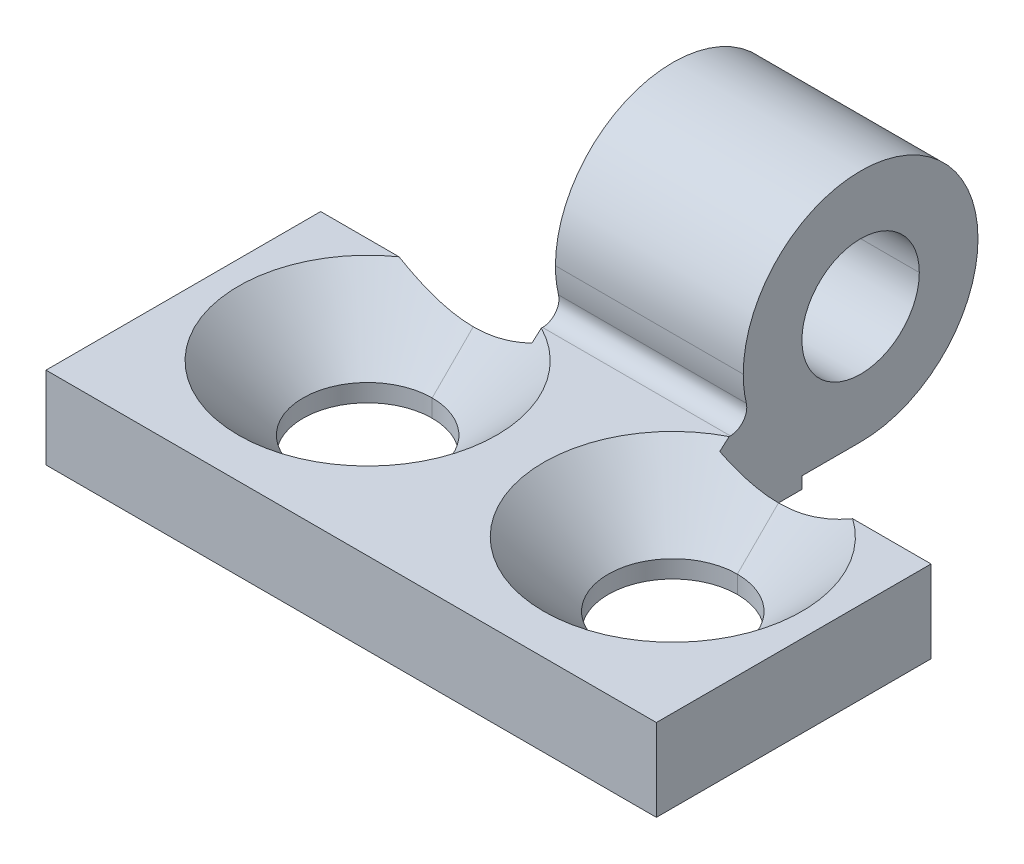
ISO-10303-21;
HEADER;
FILE_DESCRIPTION(('STEP AP214'),'2;1');
FILE_NAME('part.step','',(''),(''),'','','');
FILE_SCHEMA(('AUTOMOTIVE_DESIGN { 1 0 10303 214 1 1 1 1 }'));
ENDSEC;
DATA;
#1=APPLICATION_CONTEXT('core data for automotive mechanical design processes');
#2=APPLICATION_PROTOCOL_DEFINITION('international standard','automotive_design',2000,#1);
#3=PRODUCT_CONTEXT('',#1,'mechanical');
#4=PRODUCT('Part','Part','',(#3));
#5=PRODUCT_RELATED_PRODUCT_CATEGORY('part','',(#4));
#6=PRODUCT_DEFINITION_FORMATION('','',#4);
#7=PRODUCT_DEFINITION_CONTEXT('part definition',#1,'design');
#8=PRODUCT_DEFINITION('design','',#6,#7);
#9=PRODUCT_DEFINITION_SHAPE('','',#8);
#10=(LENGTH_UNIT() NAMED_UNIT(*) SI_UNIT(.MILLI.,.METRE.));
#11=(NAMED_UNIT(*) PLANE_ANGLE_UNIT() SI_UNIT($,.RADIAN.));
#12=(NAMED_UNIT(*) SI_UNIT($,.STERADIAN.) SOLID_ANGLE_UNIT());
#13=UNCERTAINTY_MEASURE_WITH_UNIT(LENGTH_MEASURE(1.E-05),#10,'distance_accuracy_value','');
#14=(GEOMETRIC_REPRESENTATION_CONTEXT(3) GLOBAL_UNCERTAINTY_ASSIGNED_CONTEXT((#13)) GLOBAL_UNIT_ASSIGNED_CONTEXT((#10,
#11,#12)) REPRESENTATION_CONTEXT('',''));
#15=CARTESIAN_POINT('',(0.,0.,0.));
#16=DIRECTION('',(0.,0.,1.));
#17=DIRECTION('',(1.,0.,0.));
#18=AXIS2_PLACEMENT_3D('',#15,#16,#17);
#19=CARTESIAN_POINT('',(-6.5,-2.,10.5));
#20=DIRECTION('',(0.,1.,0.));
#21=DIRECTION('',(0.,0.,1.));
#22=AXIS2_PLACEMENT_3D('',#19,#20,#21);
#23=CYLINDRICAL_SURFACE('',#22,2.75);
#24=DIRECTION('',(0.,1.,0.));
#25=VECTOR('',#24,1.);
#26=CARTESIAN_POINT('',(-6.5,-2.,7.75));
#27=LINE('',#26,#25);
#28=CARTESIAN_POINT('',(-6.5,-5.5,7.75));
#29=VERTEX_POINT('',#28);
#30=CARTESIAN_POINT('',(-6.5,-4.75,7.75));
#31=VERTEX_POINT('',#30);
#32=EDGE_CURVE('E259',#29,#31,#27,.T.);
#33=ORIENTED_EDGE('',*,*,#32,.F.);
#34=CARTESIAN_POINT('',(-6.5,-5.5,10.5));
#35=DIRECTION('',(0.,1.,0.));
#36=DIRECTION('',(0.,0.,1.));
#37=AXIS2_PLACEMENT_3D('',#34,#35,#36);
#38=CIRCLE('',#37,2.75);
#39=CARTESIAN_POINT('',(-6.5,-5.5,13.25));
#40=VERTEX_POINT('',#39);
#41=EDGE_CURVE('E206',#40,#29,#38,.T.);
#42=ORIENTED_EDGE('',*,*,#41,.F.);
#43=DIRECTION('',(0.,1.,0.));
#44=VECTOR('',#43,1.);
#45=CARTESIAN_POINT('',(-6.5,-2.,13.25));
#46=LINE('',#45,#44);
#47=CARTESIAN_POINT('',(-6.5,-4.75,13.25));
#48=VERTEX_POINT('',#47);
#49=EDGE_CURVE('E288',#40,#48,#46,.T.);
#50=ORIENTED_EDGE('',*,*,#49,.T.);
#51=CARTESIAN_POINT('',(-6.5,-4.75,10.5));
#52=DIRECTION('',(0.,1.,0.));
#53=DIRECTION('',(0.,0.,1.));
#54=AXIS2_PLACEMENT_3D('',#51,#52,#53);
#55=CIRCLE('',#54,2.75);
#56=EDGE_CURVE('E11',#48,#31,#55,.T.);
#57=ORIENTED_EDGE('',*,*,#56,.T.);
#58=EDGE_LOOP('',(#33,#42,#50,#57));
#59=FACE_BOUND('',#58,.T.);
#60=ADVANCED_FACE('F17',(#59),#23,.F.);
#61=CARTESIAN_POINT('',(-6.5,-2.,10.5));
#62=DIRECTION('',(0.,1.,0.));
#63=DIRECTION('',(0.,0.,1.));
#64=AXIS2_PLACEMENT_3D('',#61,#62,#63);
#65=CONICAL_SURFACE('',#64,5.5,0.785398163397448);
#66=DIRECTION('',(0.,0.707106781186548,-0.707106781186547));
#67=VECTOR('',#66,1.);
#68=CARTESIAN_POINT('',(-6.5,-2.,5.));
#69=LINE('',#68,#67);
#70=CARTESIAN_POINT('',(-6.5,-3.00000000000008,6.));
#71=VERTEX_POINT('',#70);
#72=EDGE_CURVE('E375',#31,#71,#69,.T.);
#73=ORIENTED_EDGE('',*,*,#72,.F.);
#74=ORIENTED_EDGE('',*,*,#56,.F.);
#75=DIRECTION('',(0.,0.707106781186548,0.707106781186548));
#76=VECTOR('',#75,1.);
#77=CARTESIAN_POINT('',(-6.5,-2.,16.));
#78=LINE('',#77,#76);
#79=CARTESIAN_POINT('',(-6.5,-2.,16.));
#80=VERTEX_POINT('',#79);
#81=EDGE_CURVE('E465',#48,#80,#78,.T.);
#82=ORIENTED_EDGE('',*,*,#81,.T.);
#83=CARTESIAN_POINT('',(-6.5,-2.,10.5));
#84=DIRECTION('',(0.,1.,0.));
#85=DIRECTION('',(0.,0.,1.));
#86=AXIS2_PLACEMENT_3D('',#83,#84,#85);
#87=CIRCLE('',#86,5.5);
#88=CARTESIAN_POINT('',(-4.,-2.,5.60102051443365));
#89=VERTEX_POINT('',#88);
#90=EDGE_CURVE('E237',#80,#89,#87,.T.);
#91=ORIENTED_EDGE('',*,*,#90,.T.);
#92=CARTESIAN_POINT('',(-4.,-2.3521849295065,6.));
#93=CARTESIAN_POINT('',(-4.,-2.23544632125815,5.86645582958906));
#94=CARTESIAN_POINT('',(-4.,-2.11799221506182,5.73348834467298));
#95=CARTESIAN_POINT('',(-4.,-2.,5.60102051443365));
#96=(BOUNDED_CURVE() B_SPLINE_CURVE(3,(#92,#93,#94,#95),.UNSPECIFIED.,.F.,
.F.) B_SPLINE_CURVE_WITH_KNOTS((4,4),(0.00209591535609788,0.00262788306866856),
.UNSPECIFIED.) CURVE() GEOMETRIC_REPRESENTATION_ITEM() RATIONAL_B_SPLINE_CURVE((1.,1.,1.,1.)) REPRESENTATION_ITEM(''));
#97=CARTESIAN_POINT('',(-4.,-2.3521849295065,6.));
#98=VERTEX_POINT('',#97);
#99=EDGE_CURVE('E43',#98,#89,#96,.T.);
#100=ORIENTED_EDGE('',*,*,#99,.F.);
#101=CARTESIAN_POINT('',(-6.5,-3.,6.));
#102=CARTESIAN_POINT('',(-5.87172955955055,-3.,6.));
#103=CARTESIAN_POINT('',(-5.21795002886599,-2.82093469499679,6.));
#104=CARTESIAN_POINT('',(-4.63830987725806,-2.66217560929837,6.));
#105=CARTESIAN_POINT('',(-4.,-2.3521849295065,6.));
#106=B_SPLINE_CURVE_WITH_KNOTS('',2,(#101,#102,#103,#104,#105),.UNSPECIFIED.,.F.,.F.,(3,2,3),
(0.,0.5,1.),.UNSPECIFIED.);
#107=EDGE_CURVE('E190',#71,#98,#106,.T.);
#108=ORIENTED_EDGE('',*,*,#107,.F.);
#109=EDGE_LOOP('',(#73,#74,#82,#91,#100,#108));
#110=FACE_BOUND('',#109,.T.);
#111=ADVANCED_FACE('F363',(#110),#65,.F.);
#112=CARTESIAN_POINT('',(6.5,-2.,10.5));
#113=DIRECTION('',(0.,1.,0.));
#114=DIRECTION('',(0.,0.,1.));
#115=AXIS2_PLACEMENT_3D('',#112,#113,#114);
#116=CYLINDRICAL_SURFACE('',#115,2.75);
#117=DIRECTION('',(0.,1.,0.));
#118=VECTOR('',#117,1.);
#119=CARTESIAN_POINT('',(6.5,-2.,7.75));
#120=LINE('',#119,#118);
#121=CARTESIAN_POINT('',(6.5,-5.5,7.75));
#122=VERTEX_POINT('',#121);
#123=CARTESIAN_POINT('',(6.5,-4.75,7.75));
#124=VERTEX_POINT('',#123);
#125=EDGE_CURVE('E248',#122,#124,#120,.T.);
#126=ORIENTED_EDGE('',*,*,#125,.F.);
#127=CARTESIAN_POINT('',(6.5,-5.5,10.5));
#128=DIRECTION('',(0.,1.,0.));
#129=DIRECTION('',(0.,0.,1.));
#130=AXIS2_PLACEMENT_3D('',#127,#128,#129);
#131=CIRCLE('',#130,2.75);
#132=CARTESIAN_POINT('',(6.5,-5.5,13.25));
#133=VERTEX_POINT('',#132);
#134=EDGE_CURVE('E232',#133,#122,#131,.T.);
#135=ORIENTED_EDGE('',*,*,#134,.F.);
#136=DIRECTION('',(0.,1.,0.));
#137=VECTOR('',#136,1.);
#138=CARTESIAN_POINT('',(6.5,-2.,13.25));
#139=LINE('',#138,#137);
#140=CARTESIAN_POINT('',(6.5,-4.75,13.25));
#141=VERTEX_POINT('',#140);
#142=EDGE_CURVE('E247',#133,#141,#139,.T.);
#143=ORIENTED_EDGE('',*,*,#142,.T.);
#144=CARTESIAN_POINT('',(6.5,-4.75,10.5));
#145=DIRECTION('',(0.,1.,0.));
#146=DIRECTION('',(0.,0.,1.));
#147=AXIS2_PLACEMENT_3D('',#144,#145,#146);
#148=CIRCLE('',#147,2.75);
#149=EDGE_CURVE('E28',#141,#124,#148,.T.);
#150=ORIENTED_EDGE('',*,*,#149,.T.);
#151=EDGE_LOOP('',(#126,#135,#143,#150));
#152=FACE_BOUND('',#151,.T.);
#153=ADVANCED_FACE('F367',(#152),#116,.F.);
#154=CARTESIAN_POINT('',(6.5,-2.,10.5));
#155=DIRECTION('',(0.,1.,0.));
#156=DIRECTION('',(0.,0.,1.));
#157=AXIS2_PLACEMENT_3D('',#154,#155,#156);
#158=CONICAL_SURFACE('',#157,5.5,0.785398163397448);
#159=DIRECTION('',(0.,0.707106781186548,-0.707106781186547));
#160=VECTOR('',#159,1.);
#161=CARTESIAN_POINT('',(6.5,-2.,5.));
#162=LINE('',#161,#160);
#163=CARTESIAN_POINT('',(6.5,-3.,6.));
#164=VERTEX_POINT('',#163);
#165=EDGE_CURVE('E455',#124,#164,#162,.T.);
#166=ORIENTED_EDGE('',*,*,#165,.F.);
#167=ORIENTED_EDGE('',*,*,#149,.F.);
#168=DIRECTION('',(0.,0.707106781186548,0.707106781186548));
#169=VECTOR('',#168,1.);
#170=CARTESIAN_POINT('',(6.5,-2.,16.));
#171=LINE('',#170,#169);
#172=CARTESIAN_POINT('',(6.5,-2.,16.));
#173=VERTEX_POINT('',#172);
#174=EDGE_CURVE('E496',#141,#173,#171,.T.);
#175=ORIENTED_EDGE('',*,*,#174,.T.);
#176=CARTESIAN_POINT('',(6.5,-2.,10.5));
#177=DIRECTION('',(0.,1.,0.));
#178=DIRECTION('',(0.,0.,1.));
#179=AXIS2_PLACEMENT_3D('',#176,#177,#178);
#180=CIRCLE('',#179,5.5);
#181=CARTESIAN_POINT('',(9.66227766016838,-2.,6.));
#182=VERTEX_POINT('',#181);
#183=EDGE_CURVE('E582',#173,#182,#180,.T.);
#184=ORIENTED_EDGE('',*,*,#183,.T.);
#185=CARTESIAN_POINT('',(6.5,-3.,6.));
#186=CARTESIAN_POINT('',(7.29819902834633,-3.,6.));
#187=CARTESIAN_POINT('',(8.14875076669023,-2.70746631825487,6.));
#188=CARTESIAN_POINT('',(8.85322029363691,-2.46517527926856,6.));
#189=CARTESIAN_POINT('',(9.66227766016838,-2.,6.));
#190=B_SPLINE_CURVE_WITH_KNOTS('',2,(#185,#186,#187,#188,#189),.UNSPECIFIED.,.F.,.F.,(3,2,3),
(0.,0.5,1.),.UNSPECIFIED.);
#191=EDGE_CURVE('E293',#164,#182,#190,.T.);
#192=ORIENTED_EDGE('',*,*,#191,.F.);
#193=EDGE_LOOP('',(#166,#167,#175,#184,#192));
#194=FACE_BOUND('',#193,.T.);
#195=ADVANCED_FACE('F641',(#194),#158,.F.);
#196=CARTESIAN_POINT('',(4.,5.,6.));
#197=DIRECTION('',(-1.,0.,0.));
#198=DIRECTION('',(0.,0.,1.));
#199=AXIS2_PLACEMENT_3D('',#196,#197,#198);
#200=PLANE('',#199);
#201=CARTESIAN_POINT('',(4.,0.,0.));
#202=DIRECTION('',(-1.,0.,0.));
#203=DIRECTION('',(0.,0.,1.));
#204=AXIS2_PLACEMENT_3D('',#201,#202,#203);
#205=CIRCLE('',#204,2.5);
#206=CARTESIAN_POINT('',(4.,0.,2.5));
#207=VERTEX_POINT('',#206);
#208=CARTESIAN_POINT('',(4.,0.,-2.5));
#209=VERTEX_POINT('',#208);
#210=EDGE_CURVE('E279',#207,#209,#205,.T.);
#211=ORIENTED_EDGE('',*,*,#210,.T.);
#212=CARTESIAN_POINT('',(4.,0.,0.));
#213=DIRECTION('',(-1.,0.,0.));
#214=DIRECTION('',(0.,0.,1.));
#215=AXIS2_PLACEMENT_3D('',#212,#213,#214);
#216=CIRCLE('',#215,2.5);
#217=EDGE_CURVE('E434',#209,#207,#216,.T.);
#218=ORIENTED_EDGE('',*,*,#217,.T.);
#219=EDGE_LOOP('',(#211,#218));
#220=FACE_BOUND('',#219,.T.);
#221=DIRECTION('',(0.,0.,-1.));
#222=VECTOR('',#221,1.);
#223=CARTESIAN_POINT('',(4.,-2.,4.58257569495584));
#224=LINE('',#223,#222);
#225=CARTESIAN_POINT('',(4.,-2.,5.60102051443364));
#226=VERTEX_POINT('',#225);
#227=CARTESIAN_POINT('',(4.,-2.,5.54977477020464));
#228=VERTEX_POINT('',#227);
#229=EDGE_CURVE('E224',#226,#228,#224,.T.);
#230=ORIENTED_EDGE('',*,*,#229,.F.);
#231=CARTESIAN_POINT('',(4.,-2.,5.60102051443364));
#232=CARTESIAN_POINT('',(4.,-2.11799221506182,5.73348834467298));
#233=CARTESIAN_POINT('',(4.,-2.23544632125815,5.86645582958905));
#234=CARTESIAN_POINT('',(4.,-2.3521849295065,6.));
#235=(BOUNDED_CURVE() B_SPLINE_CURVE(3,(#231,#232,#233,#234),.UNSPECIFIED.,.F.,
.F.) B_SPLINE_CURVE_WITH_KNOTS((4,4),(0.00563640099351163,0.00616843623537181),
.UNSPECIFIED.) CURVE() GEOMETRIC_REPRESENTATION_ITEM() RATIONAL_B_SPLINE_CURVE((1.,1.,1.,1.)) REPRESENTATION_ITEM(''));
#236=CARTESIAN_POINT('',(4.,-2.3521849295065,6.));
#237=VERTEX_POINT('',#236);
#238=EDGE_CURVE('E531',#226,#237,#235,.T.);
#239=ORIENTED_EDGE('',*,*,#238,.T.);
#240=DIRECTION('',(0.,-1.,0.));
#241=VECTOR('',#240,1.);
#242=CARTESIAN_POINT('',(4.,5.,6.));
#243=LINE('',#242,#241);
#244=CARTESIAN_POINT('',(4.,-5.5,6.));
#245=VERTEX_POINT('',#244);
#246=EDGE_CURVE('E335',#237,#245,#243,.T.);
#247=ORIENTED_EDGE('',*,*,#246,.T.);
#248=DIRECTION('',(0.,0.,-1.));
#249=VECTOR('',#248,1.);
#250=CARTESIAN_POINT('',(4.,-5.5,6.));
#251=LINE('',#250,#249);
#252=CARTESIAN_POINT('',(4.,-5.5,2.5));
#253=VERTEX_POINT('',#252);
#254=EDGE_CURVE('E220',#245,#253,#251,.T.);
#255=ORIENTED_EDGE('',*,*,#254,.T.);
#256=DIRECTION('',(0.,-1.,0.));
#257=VECTOR('',#256,1.);
#258=CARTESIAN_POINT('',(4.,-5.5,2.5));
#259=LINE('',#258,#257);
#260=CARTESIAN_POINT('',(4.,-5.,2.5));
#261=VERTEX_POINT('',#260);
#262=EDGE_CURVE('E226',#261,#253,#259,.T.);
#263=ORIENTED_EDGE('',*,*,#262,.F.);
#264=DIRECTION('',(0.,0.,1.));
#265=VECTOR('',#264,1.);
#266=CARTESIAN_POINT('',(4.,-5.,2.5));
#267=LINE('',#266,#265);
#268=CARTESIAN_POINT('',(4.,-5.,0.));
#269=VERTEX_POINT('',#268);
#270=EDGE_CURVE('E254',#269,#261,#267,.T.);
#271=ORIENTED_EDGE('',*,*,#270,.F.);
#272=CARTESIAN_POINT('',(4.,0.,0.));
#273=DIRECTION('',(-1.,0.,0.));
#274=DIRECTION('',(0.,0.,1.));
#275=AXIS2_PLACEMENT_3D('',#272,#273,#274);
#276=CIRCLE('',#275,5.);
#277=CARTESIAN_POINT('',(4.,0.,-5.));
#278=VERTEX_POINT('',#277);
#279=EDGE_CURVE('E435',#278,#269,#276,.T.);
#280=ORIENTED_EDGE('',*,*,#279,.F.);
#281=CARTESIAN_POINT('',(4.,0.,0.));
#282=DIRECTION('',(-1.,0.,0.));
#283=DIRECTION('',(0.,0.,1.));
#284=AXIS2_PLACEMENT_3D('',#281,#282,#283);
#285=CIRCLE('',#284,5.);
#286=CARTESIAN_POINT('',(4.,0.,5.));
#287=VERTEX_POINT('',#286);
#288=EDGE_CURVE('E283',#287,#278,#285,.T.);
#289=ORIENTED_EDGE('',*,*,#288,.F.);
#290=CARTESIAN_POINT('',(4.,0.,0.));
#291=DIRECTION('',(-1.,0.,0.));
#292=DIRECTION('',(0.,0.,1.));
#293=AXIS2_PLACEMENT_3D('',#290,#291,#292);
#294=CIRCLE('',#293,5.);
#295=CARTESIAN_POINT('',(4.,-1.14035087719298,4.86822348263565));
#296=VERTEX_POINT('',#295);
#297=EDGE_CURVE('E450',#296,#287,#294,.T.);
#298=ORIENTED_EDGE('',*,*,#297,.F.);
#299=CARTESIAN_POINT('',(4.,-1.3,5.54977477020464));
#300=DIRECTION('',(1.,0.,0.));
#301=DIRECTION('',(0.,0.,1.));
#302=AXIS2_PLACEMENT_3D('',#299,#300,#301);
#303=CIRCLE('',#302,0.7);
#304=EDGE_CURVE('E239',#228,#296,#303,.T.);
#305=ORIENTED_EDGE('',*,*,#304,.F.);
#306=EDGE_LOOP('',(#230,#239,#247,#255,#263,#271,#280,#289,#298,#305));
#307=FACE_BOUND('',#306,.T.);
#308=ADVANCED_FACE('F310',(#220,#307),#200,.F.);
#309=CARTESIAN_POINT('',(13.,5.,6.));
#310=DIRECTION('',(0.,0.,1.));
#311=DIRECTION('',(1.,0.,0.));
#312=AXIS2_PLACEMENT_3D('',#309,#310,#311);
#313=PLANE('',#312);
#314=ORIENTED_EDGE('',*,*,#246,.F.);
#315=CARTESIAN_POINT('',(4.,-2.3521849295065,6.));
#316=CARTESIAN_POINT('',(4.63356689461019,-2.65987221330369,6.));
#317=CARTESIAN_POINT('',(5.21025336837822,-2.81881998062672,6.));
#318=CARTESIAN_POINT('',(5.8676018058511,-3.,6.));
#319=CARTESIAN_POINT('',(6.5,-3.,6.));
#320=B_SPLINE_CURVE_WITH_KNOTS('',2,(#315,#316,#317,#318,#319),.UNSPECIFIED.,.F.,.F.,(3,2,3),
(0.,0.5,1.),.UNSPECIFIED.);
#321=EDGE_CURVE('E331',#237,#164,#320,.T.);
#322=ORIENTED_EDGE('',*,*,#321,.T.);
#323=ORIENTED_EDGE('',*,*,#191,.T.);
#324=DIRECTION('',(-1.,0.,0.));
#325=VECTOR('',#324,1.);
#326=CARTESIAN_POINT('',(13.,-2.,6.));
#327=LINE('',#326,#325);
#328=CARTESIAN_POINT('',(13.,-2.,6.));
#329=VERTEX_POINT('',#328);
#330=EDGE_CURVE('E586',#329,#182,#327,.T.);
#331=ORIENTED_EDGE('',*,*,#330,.F.);
#332=DIRECTION('',(0.,-1.,0.));
#333=VECTOR('',#332,1.);
#334=CARTESIAN_POINT('',(13.,5.,6.));
#335=LINE('',#334,#333);
#336=CARTESIAN_POINT('',(13.,-5.5,6.));
#337=VERTEX_POINT('',#336);
#338=EDGE_CURVE('E485',#329,#337,#335,.T.);
#339=ORIENTED_EDGE('',*,*,#338,.T.);
#340=DIRECTION('',(-1.,0.,0.));
#341=VECTOR('',#340,1.);
#342=CARTESIAN_POINT('',(13.,-5.5,6.));
#343=LINE('',#342,#341);
#344=EDGE_CURVE('E213',#337,#245,#343,.T.);
#345=ORIENTED_EDGE('',*,*,#344,.T.);
#346=EDGE_LOOP('',(#314,#322,#323,#331,#339,#345));
#347=FACE_BOUND('',#346,.T.);
#348=ADVANCED_FACE('F300',(#347),#313,.F.);
#349=CARTESIAN_POINT('',(-4.,5.,6.));
#350=DIRECTION('',(1.,0.,0.));
#351=DIRECTION('',(0.,1.,0.));
#352=AXIS2_PLACEMENT_3D('',#349,#350,#351);
#353=PLANE('',#352);
#354=CARTESIAN_POINT('',(-4.,0.,0.));
#355=DIRECTION('',(1.,0.,0.));
#356=DIRECTION('',(0.,0.,-1.));
#357=AXIS2_PLACEMENT_3D('',#354,#355,#356);
#358=CIRCLE('',#357,2.5);
#359=CARTESIAN_POINT('',(-4.,0.,2.5));
#360=VERTEX_POINT('',#359);
#361=CARTESIAN_POINT('',(-4.,0.,-2.5));
#362=VERTEX_POINT('',#361);
#363=EDGE_CURVE('E260',#360,#362,#358,.T.);
#364=ORIENTED_EDGE('',*,*,#363,.T.);
#365=CARTESIAN_POINT('',(-4.,0.,0.));
#366=DIRECTION('',(1.,0.,0.));
#367=DIRECTION('',(0.,0.,-1.));
#368=AXIS2_PLACEMENT_3D('',#365,#366,#367);
#369=CIRCLE('',#368,2.5);
#370=EDGE_CURVE('E243',#362,#360,#369,.T.);
#371=ORIENTED_EDGE('',*,*,#370,.T.);
#372=EDGE_LOOP('',(#364,#371));
#373=FACE_BOUND('',#372,.T.);
#374=DIRECTION('',(0.,-1.,0.));
#375=VECTOR('',#374,1.);
#376=CARTESIAN_POINT('',(-4.,5.,6.));
#377=LINE('',#376,#375);
#378=CARTESIAN_POINT('',(-4.,-5.5,6.));
#379=VERTEX_POINT('',#378);
#380=EDGE_CURVE('E182',#98,#379,#377,.T.);
#381=ORIENTED_EDGE('',*,*,#380,.F.);
#382=ORIENTED_EDGE('',*,*,#99,.T.);
#383=DIRECTION('',(0.,0.,1.));
#384=VECTOR('',#383,1.);
#385=CARTESIAN_POINT('',(-4.,-2.,4.58257569495584));
#386=LINE('',#385,#384);
#387=CARTESIAN_POINT('',(-4.,-2.,5.54977477020464));
#388=VERTEX_POINT('',#387);
#389=EDGE_CURVE('E233',#388,#89,#386,.T.);
#390=ORIENTED_EDGE('',*,*,#389,.F.);
#391=CARTESIAN_POINT('',(-4.,-1.3,5.54977477020464));
#392=DIRECTION('',(-1.,0.,0.));
#393=DIRECTION('',(0.,0.,-1.));
#394=AXIS2_PLACEMENT_3D('',#391,#392,#393);
#395=CIRCLE('',#394,0.7);
#396=CARTESIAN_POINT('',(-4.,-1.14035087719298,4.86822348263565));
#397=VERTEX_POINT('',#396);
#398=EDGE_CURVE('E242',#397,#388,#395,.T.);
#399=ORIENTED_EDGE('',*,*,#398,.F.);
#400=CARTESIAN_POINT('',(-4.,0.,0.));
#401=DIRECTION('',(1.,0.,0.));
#402=DIRECTION('',(0.,0.,-1.));
#403=AXIS2_PLACEMENT_3D('',#400,#401,#402);
#404=CIRCLE('',#403,5.);
#405=CARTESIAN_POINT('',(-4.,0.,5.));
#406=VERTEX_POINT('',#405);
#407=EDGE_CURVE('E510',#406,#397,#404,.T.);
#408=ORIENTED_EDGE('',*,*,#407,.F.);
#409=CARTESIAN_POINT('',(-4.,0.,0.));
#410=DIRECTION('',(1.,0.,0.));
#411=DIRECTION('',(0.,0.,-1.));
#412=AXIS2_PLACEMENT_3D('',#409,#410,#411);
#413=CIRCLE('',#412,5.);
#414=CARTESIAN_POINT('',(-4.,0.,-5.));
#415=VERTEX_POINT('',#414);
#416=EDGE_CURVE('E426',#415,#406,#413,.T.);
#417=ORIENTED_EDGE('',*,*,#416,.F.);
#418=CARTESIAN_POINT('',(-4.,0.,0.));
#419=DIRECTION('',(1.,0.,0.));
#420=DIRECTION('',(0.,0.,-1.));
#421=AXIS2_PLACEMENT_3D('',#418,#419,#420);
#422=CIRCLE('',#421,5.);
#423=CARTESIAN_POINT('',(-4.,-5.,0.));
#424=VERTEX_POINT('',#423);
#425=EDGE_CURVE('E238',#424,#415,#422,.T.);
#426=ORIENTED_EDGE('',*,*,#425,.F.);
#427=DIRECTION('',(0.,0.,-1.));
#428=VECTOR('',#427,1.);
#429=CARTESIAN_POINT('',(-4.,-5.,2.5));
#430=LINE('',#429,#428);
#431=CARTESIAN_POINT('',(-4.,-5.,2.5));
#432=VERTEX_POINT('',#431);
#433=EDGE_CURVE('E438',#432,#424,#430,.T.);
#434=ORIENTED_EDGE('',*,*,#433,.F.);
#435=DIRECTION('',(0.,1.,0.));
#436=VECTOR('',#435,1.);
#437=CARTESIAN_POINT('',(-4.,-5.5,2.5));
#438=LINE('',#437,#436);
#439=CARTESIAN_POINT('',(-4.,-5.5,2.5));
#440=VERTEX_POINT('',#439);
#441=EDGE_CURVE('E201',#440,#432,#438,.T.);
#442=ORIENTED_EDGE('',*,*,#441,.F.);
#443=DIRECTION('',(0.,0.,1.));
#444=VECTOR('',#443,1.);
#445=CARTESIAN_POINT('',(-4.,-5.5,6.));
#446=LINE('',#445,#444);
#447=EDGE_CURVE('E197',#440,#379,#446,.T.);
#448=ORIENTED_EDGE('',*,*,#447,.T.);
#449=EDGE_LOOP('',(#381,#382,#390,#399,#408,#417,#426,#434,#442,#448));
#450=FACE_BOUND('',#449,.T.);
#451=ADVANCED_FACE('F198',(#373,#450),#353,.F.);
#452=CARTESIAN_POINT('',(-13.,5.,6.));
#453=DIRECTION('',(0.,0.,1.));
#454=DIRECTION('',(1.,0.,0.));
#455=AXIS2_PLACEMENT_3D('',#452,#453,#454);
#456=PLANE('',#455);
#457=DIRECTION('',(-1.,0.,0.));
#458=VECTOR('',#457,1.);
#459=CARTESIAN_POINT('',(13.,-2.,6.));
#460=LINE('',#459,#458);
#461=CARTESIAN_POINT('',(-9.66227766016838,-2.,6.));
#462=VERTEX_POINT('',#461);
#463=CARTESIAN_POINT('',(-13.,-2.,6.));
#464=VERTEX_POINT('',#463);
#465=EDGE_CURVE('E503',#462,#464,#460,.T.);
#466=ORIENTED_EDGE('',*,*,#465,.F.);
#467=CARTESIAN_POINT('',(-9.66227766016838,-2.,6.));
#468=CARTESIAN_POINT('',(-8.85234910194744,-2.46567617927172,6.));
#469=CARTESIAN_POINT('',(-8.14619709826909,-2.70834424375565,6.));
#470=CARTESIAN_POINT('',(-7.73445079479649,-2.84984023612222,6.));
#471=CARTESIAN_POINT('',(-7.34007796396944,-2.92225699874413,6.));
#472=CARTESIAN_POINT('',(-6.91669908907586,-3.,6.));
#473=CARTESIAN_POINT('',(-6.5,-3.,6.));
#474=B_SPLINE_CURVE_WITH_KNOTS('',2,(#467,#468,#469,#470,#471,#472,#473),.UNSPECIFIED.,.F.,.F.,
(3,2,2,3),(0.,0.5,0.75,1.),.UNSPECIFIED.);
#475=EDGE_CURVE('E384',#462,#71,#474,.T.);
#476=ORIENTED_EDGE('',*,*,#475,.T.);
#477=ORIENTED_EDGE('',*,*,#107,.T.);
#478=ORIENTED_EDGE('',*,*,#380,.T.);
#479=DIRECTION('',(-1.,0.,0.));
#480=VECTOR('',#479,1.);
#481=CARTESIAN_POINT('',(-13.,-5.5,6.));
#482=LINE('',#481,#480);
#483=CARTESIAN_POINT('',(-13.,-5.5,6.));
#484=VERTEX_POINT('',#483);
#485=EDGE_CURVE('E187',#379,#484,#482,.T.);
#486=ORIENTED_EDGE('',*,*,#485,.T.);
#487=DIRECTION('',(0.,-1.,0.));
#488=VECTOR('',#487,1.);
#489=CARTESIAN_POINT('',(-13.,5.,6.));
#490=LINE('',#489,#488);
#491=EDGE_CURVE('E506',#464,#484,#490,.T.);
#492=ORIENTED_EDGE('',*,*,#491,.F.);
#493=EDGE_LOOP('',(#466,#476,#477,#478,#486,#492));
#494=FACE_BOUND('',#493,.T.);
#495=ADVANCED_FACE('F184',(#494),#456,.F.);
#496=CARTESIAN_POINT('',(13.,-1.3,5.54977477020464));
#497=DIRECTION('',(-1.,0.,0.));
#498=DIRECTION('',(0.,0.,1.));
#499=AXIS2_PLACEMENT_3D('',#496,#497,#498);
#500=CYLINDRICAL_SURFACE('',#499,0.7);
#501=DIRECTION('',(-1.,0.,0.));
#502=VECTOR('',#501,1.);
#503=CARTESIAN_POINT('',(-13.,-2.,5.54977477020464));
#504=LINE('',#503,#502);
#505=EDGE_CURVE('E519',#228,#388,#504,.T.);
#506=ORIENTED_EDGE('',*,*,#505,.F.);
#507=ORIENTED_EDGE('',*,*,#304,.T.);
#508=DIRECTION('',(1.,0.,0.));
#509=VECTOR('',#508,1.);
#510=CARTESIAN_POINT('',(13.,-1.14035087719298,4.86822348263565));
#511=LINE('',#510,#509);
#512=EDGE_CURVE('E493',#397,#296,#511,.T.);
#513=ORIENTED_EDGE('',*,*,#512,.F.);
#514=ORIENTED_EDGE('',*,*,#398,.T.);
#515=EDGE_LOOP('',(#506,#507,#513,#514));
#516=FACE_BOUND('',#515,.T.);
#517=ADVANCED_FACE('F312',(#516),#500,.F.);
#518=CARTESIAN_POINT('',(13.,0.,0.));
#519=DIRECTION('',(-1.,0.,0.));
#520=DIRECTION('',(0.,0.,1.));
#521=AXIS2_PLACEMENT_3D('',#518,#519,#520);
#522=CYLINDRICAL_SURFACE('',#521,2.5);
#523=DIRECTION('',(-1.,0.,0.));
#524=VECTOR('',#523,1.);
#525=CARTESIAN_POINT('',(13.,0.,-2.5));
#526=LINE('',#525,#524);
#527=EDGE_CURVE('E265',#209,#362,#526,.T.);
#528=ORIENTED_EDGE('',*,*,#527,.F.);
#529=ORIENTED_EDGE('',*,*,#210,.F.);
#530=DIRECTION('',(-1.,0.,0.));
#531=VECTOR('',#530,1.);
#532=CARTESIAN_POINT('',(13.,0.,2.5));
#533=LINE('',#532,#531);
#534=EDGE_CURVE('E264',#207,#360,#533,.T.);
#535=ORIENTED_EDGE('',*,*,#534,.T.);
#536=ORIENTED_EDGE('',*,*,#370,.F.);
#537=EDGE_LOOP('',(#528,#529,#535,#536));
#538=FACE_BOUND('',#537,.T.);
#539=ADVANCED_FACE('F720',(#538),#522,.F.);
#540=CARTESIAN_POINT('',(13.,-2.,4.58257569495584));
#541=DIRECTION('',(0.,-1.,0.));
#542=DIRECTION('',(0.,0.,-1.));
#543=AXIS2_PLACEMENT_3D('',#540,#541,#542);
#544=PLANE('',#543);
#545=ORIENTED_EDGE('',*,*,#389,.T.);
#546=ORIENTED_EDGE('',*,*,#90,.F.);
#547=CARTESIAN_POINT('',(-6.5,-2.,10.5));
#548=DIRECTION('',(0.,1.,0.));
#549=DIRECTION('',(0.,0.,1.));
#550=AXIS2_PLACEMENT_3D('',#547,#548,#549);
#551=CIRCLE('',#550,5.5);
#552=EDGE_CURVE('E472',#462,#80,#551,.T.);
#553=ORIENTED_EDGE('',*,*,#552,.F.);
#554=ORIENTED_EDGE('',*,*,#465,.T.);
#555=DIRECTION('',(0.,0.,1.));
#556=VECTOR('',#555,1.);
#557=CARTESIAN_POINT('',(-13.,-2.,4.58257569495584));
#558=LINE('',#557,#556);
#559=CARTESIAN_POINT('',(-13.,-2.,17.7));
#560=VERTEX_POINT('',#559);
#561=EDGE_CURVE('E489',#464,#560,#558,.T.);
#562=ORIENTED_EDGE('',*,*,#561,.T.);
#563=DIRECTION('',(-1.,0.,0.));
#564=VECTOR('',#563,1.);
#565=CARTESIAN_POINT('',(13.,-2.,17.7));
#566=LINE('',#565,#564);
#567=CARTESIAN_POINT('',(13.,-2.,17.7));
#568=VERTEX_POINT('',#567);
#569=EDGE_CURVE('E275',#568,#560,#566,.T.);
#570=ORIENTED_EDGE('',*,*,#569,.F.);
#571=DIRECTION('',(0.,0.,1.));
#572=VECTOR('',#571,1.);
#573=CARTESIAN_POINT('',(13.,-2.,4.58257569495584));
#574=LINE('',#573,#572);
#575=EDGE_CURVE('E271',#329,#568,#574,.T.);
#576=ORIENTED_EDGE('',*,*,#575,.F.);
#577=ORIENTED_EDGE('',*,*,#330,.T.);
#578=ORIENTED_EDGE('',*,*,#183,.F.);
#579=CARTESIAN_POINT('',(6.5,-2.,10.5));
#580=DIRECTION('',(0.,1.,0.));
#581=DIRECTION('',(0.,0.,1.));
#582=AXIS2_PLACEMENT_3D('',#579,#580,#581);
#583=CIRCLE('',#582,5.5);
#584=EDGE_CURVE('E500',#226,#173,#583,.T.);
#585=ORIENTED_EDGE('',*,*,#584,.F.);
#586=ORIENTED_EDGE('',*,*,#229,.T.);
#587=ORIENTED_EDGE('',*,*,#505,.T.);
#588=EDGE_LOOP('',(#545,#546,#553,#554,#562,#570,#576,#577,#578,#585,#586,#587));
#589=FACE_BOUND('',#588,.T.);
#590=ADVANCED_FACE('F577',(#589),#544,.F.);
#591=CARTESIAN_POINT('',(13.,0.,0.));
#592=DIRECTION('',(-1.,0.,0.));
#593=DIRECTION('',(0.,0.,1.));
#594=AXIS2_PLACEMENT_3D('',#591,#592,#593);
#595=CYLINDRICAL_SURFACE('',#594,5.);
#596=DIRECTION('',(-1.,0.,0.));
#597=VECTOR('',#596,1.);
#598=CARTESIAN_POINT('',(13.,0.,-5.));
#599=LINE('',#598,#597);
#600=EDGE_CURVE('E425',#278,#415,#599,.T.);
#601=ORIENTED_EDGE('',*,*,#600,.F.);
#602=ORIENTED_EDGE('',*,*,#279,.T.);
#603=DIRECTION('',(-1.,0.,0.));
#604=VECTOR('',#603,1.);
#605=CARTESIAN_POINT('',(13.,-5.,0.));
#606=LINE('',#605,#604);
#607=EDGE_CURVE('E250',#269,#424,#606,.T.);
#608=ORIENTED_EDGE('',*,*,#607,.T.);
#609=ORIENTED_EDGE('',*,*,#425,.T.);
#610=EDGE_LOOP('',(#601,#602,#608,#609));
#611=FACE_BOUND('',#610,.T.);
#612=ADVANCED_FACE('F738',(#611),#595,.T.);
#613=CARTESIAN_POINT('',(13.,-5.,2.5));
#614=DIRECTION('',(0.,1.,0.));
#615=DIRECTION('',(1.,0.,0.));
#616=AXIS2_PLACEMENT_3D('',#613,#614,#615);
#617=PLANE('',#616);
#618=ORIENTED_EDGE('',*,*,#607,.F.);
#619=ORIENTED_EDGE('',*,*,#270,.T.);
#620=DIRECTION('',(-1.,0.,0.));
#621=VECTOR('',#620,1.);
#622=CARTESIAN_POINT('',(13.,-5.,2.5));
#623=LINE('',#622,#621);
#624=EDGE_CURVE('E229',#261,#432,#623,.T.);
#625=ORIENTED_EDGE('',*,*,#624,.T.);
#626=ORIENTED_EDGE('',*,*,#433,.T.);
#627=EDGE_LOOP('',(#618,#619,#625,#626));
#628=FACE_BOUND('',#627,.T.);
#629=ADVANCED_FACE('F361',(#628),#617,.F.);
#630=CARTESIAN_POINT('',(13.,-5.5,2.5));
#631=DIRECTION('',(0.,0.,1.));
#632=DIRECTION('',(1.,0.,0.));
#633=AXIS2_PLACEMENT_3D('',#630,#631,#632);
#634=PLANE('',#633);
#635=ORIENTED_EDGE('',*,*,#624,.F.);
#636=ORIENTED_EDGE('',*,*,#262,.T.);
#637=DIRECTION('',(-1.,0.,0.));
#638=VECTOR('',#637,1.);
#639=CARTESIAN_POINT('',(13.,-5.5,2.5));
#640=LINE('',#639,#638);
#641=EDGE_CURVE('E272',#253,#440,#640,.T.);
#642=ORIENTED_EDGE('',*,*,#641,.T.);
#643=ORIENTED_EDGE('',*,*,#441,.T.);
#644=EDGE_LOOP('',(#635,#636,#642,#643));
#645=FACE_BOUND('',#644,.T.);
#646=ADVANCED_FACE('F358',(#645),#634,.F.);
#647=CARTESIAN_POINT('',(13.,-5.5,17.7));
#648=DIRECTION('',(0.,1.,0.));
#649=DIRECTION('',(1.,0.,0.));
#650=AXIS2_PLACEMENT_3D('',#647,#648,#649);
#651=PLANE('',#650);
#652=ORIENTED_EDGE('',*,*,#134,.T.);
#653=CARTESIAN_POINT('',(6.5,-5.5,10.5));
#654=DIRECTION('',(0.,1.,0.));
#655=DIRECTION('',(0.,0.,1.));
#656=AXIS2_PLACEMENT_3D('',#653,#654,#655);
#657=CIRCLE('',#656,2.75);
#658=EDGE_CURVE('E458',#122,#133,#657,.T.);
#659=ORIENTED_EDGE('',*,*,#658,.T.);
#660=EDGE_LOOP('',(#652,#659));
#661=FACE_BOUND('',#660,.T.);
#662=ORIENTED_EDGE('',*,*,#41,.T.);
#663=CARTESIAN_POINT('',(-6.5,-5.5,10.5));
#664=DIRECTION('',(0.,1.,0.));
#665=DIRECTION('',(0.,0.,1.));
#666=AXIS2_PLACEMENT_3D('',#663,#664,#665);
#667=CIRCLE('',#666,2.75);
#668=EDGE_CURVE('E255',#29,#40,#667,.T.);
#669=ORIENTED_EDGE('',*,*,#668,.T.);
#670=EDGE_LOOP('',(#662,#669));
#671=FACE_BOUND('',#670,.T.);
#672=ORIENTED_EDGE('',*,*,#641,.F.);
#673=ORIENTED_EDGE('',*,*,#254,.F.);
#674=ORIENTED_EDGE('',*,*,#344,.F.);
#675=DIRECTION('',(0.,0.,-1.));
#676=VECTOR('',#675,1.);
#677=CARTESIAN_POINT('',(13.,-5.5,17.7));
#678=LINE('',#677,#676);
#679=CARTESIAN_POINT('',(13.,-5.5,17.7));
#680=VERTEX_POINT('',#679);
#681=EDGE_CURVE('E270',#680,#337,#678,.T.);
#682=ORIENTED_EDGE('',*,*,#681,.F.);
#683=DIRECTION('',(-1.,0.,0.));
#684=VECTOR('',#683,1.);
#685=CARTESIAN_POINT('',(13.,-5.5,17.7));
#686=LINE('',#685,#684);
#687=CARTESIAN_POINT('',(-13.,-5.5,17.7));
#688=VERTEX_POINT('',#687);
#689=EDGE_CURVE('E476',#680,#688,#686,.T.);
#690=ORIENTED_EDGE('',*,*,#689,.T.);
#691=DIRECTION('',(0.,0.,-1.));
#692=VECTOR('',#691,1.);
#693=CARTESIAN_POINT('',(-13.,-5.5,17.7));
#694=LINE('',#693,#692);
#695=EDGE_CURVE('E210',#688,#484,#694,.T.);
#696=ORIENTED_EDGE('',*,*,#695,.T.);
#697=ORIENTED_EDGE('',*,*,#485,.F.);
#698=ORIENTED_EDGE('',*,*,#447,.F.);
#699=EDGE_LOOP('',(#672,#673,#674,#682,#690,#696,#697,#698));
#700=FACE_BOUND('',#699,.T.);
#701=ADVANCED_FACE('F208',(#661,#671,#700),#651,.F.);
#702=CARTESIAN_POINT('',(13.,-2.,17.7));
#703=DIRECTION('',(0.,0.,-1.));
#704=DIRECTION('',(0.,-1.,0.));
#705=AXIS2_PLACEMENT_3D('',#702,#703,#704);
#706=PLANE('',#705);
#707=DIRECTION('',(0.,-1.,0.));
#708=VECTOR('',#707,1.);
#709=CARTESIAN_POINT('',(-13.,-2.,17.7));
#710=LINE('',#709,#708);
#711=EDGE_CURVE('E478',#560,#688,#710,.T.);
#712=ORIENTED_EDGE('',*,*,#711,.T.);
#713=ORIENTED_EDGE('',*,*,#689,.F.);
#714=DIRECTION('',(0.,-1.,0.));
#715=VECTOR('',#714,1.);
#716=CARTESIAN_POINT('',(13.,-2.,17.7));
#717=LINE('',#716,#715);
#718=EDGE_CURVE('E266',#568,#680,#717,.T.);
#719=ORIENTED_EDGE('',*,*,#718,.F.);
#720=ORIENTED_EDGE('',*,*,#569,.T.);
#721=EDGE_LOOP('',(#712,#713,#719,#720));
#722=FACE_BOUND('',#721,.T.);
#723=ADVANCED_FACE('F356',(#722),#706,.F.);
#724=CARTESIAN_POINT('',(-13.,0.,0.));
#725=DIRECTION('',(1.,0.,0.));
#726=DIRECTION('',(0.,1.,0.));
#727=AXIS2_PLACEMENT_3D('',#724,#725,#726);
#728=PLANE('',#727);
#729=ORIENTED_EDGE('',*,*,#561,.F.);
#730=ORIENTED_EDGE('',*,*,#491,.T.);
#731=ORIENTED_EDGE('',*,*,#695,.F.);
#732=ORIENTED_EDGE('',*,*,#711,.F.);
#733=EDGE_LOOP('',(#729,#730,#731,#732));
#734=FACE_BOUND('',#733,.T.);
#735=ADVANCED_FACE('F353',(#734),#728,.F.);
#736=CARTESIAN_POINT('',(13.,0.,0.));
#737=DIRECTION('',(1.,0.,0.));
#738=DIRECTION('',(0.,1.,0.));
#739=AXIS2_PLACEMENT_3D('',#736,#737,#738);
#740=PLANE('',#739);
#741=ORIENTED_EDGE('',*,*,#338,.F.);
#742=ORIENTED_EDGE('',*,*,#575,.T.);
#743=ORIENTED_EDGE('',*,*,#718,.T.);
#744=ORIENTED_EDGE('',*,*,#681,.T.);
#745=EDGE_LOOP('',(#741,#742,#743,#744));
#746=FACE_BOUND('',#745,.T.);
#747=ADVANCED_FACE('F351',(#746),#740,.T.);
#748=CARTESIAN_POINT('',(13.,0.,0.));
#749=DIRECTION('',(-1.,0.,0.));
#750=DIRECTION('',(0.,0.,1.));
#751=AXIS2_PLACEMENT_3D('',#748,#749,#750);
#752=CYLINDRICAL_SURFACE('',#751,5.);
#753=ORIENTED_EDGE('',*,*,#297,.T.);
#754=DIRECTION('',(-1.,0.,0.));
#755=VECTOR('',#754,1.);
#756=CARTESIAN_POINT('',(13.,0.,5.));
#757=LINE('',#756,#755);
#758=EDGE_CURVE('E430',#287,#406,#757,.T.);
#759=ORIENTED_EDGE('',*,*,#758,.T.);
#760=ORIENTED_EDGE('',*,*,#407,.T.);
#761=ORIENTED_EDGE('',*,*,#512,.T.);
#762=EDGE_LOOP('',(#753,#759,#760,#761));
#763=FACE_BOUND('',#762,.T.);
#764=ADVANCED_FACE('F347',(#763),#752,.T.);
#765=CARTESIAN_POINT('',(13.,0.,0.));
#766=DIRECTION('',(-1.,0.,0.));
#767=DIRECTION('',(0.,0.,1.));
#768=AXIS2_PLACEMENT_3D('',#765,#766,#767);
#769=CYLINDRICAL_SURFACE('',#768,5.);
#770=ORIENTED_EDGE('',*,*,#288,.T.);
#771=ORIENTED_EDGE('',*,*,#600,.T.);
#772=ORIENTED_EDGE('',*,*,#416,.T.);
#773=ORIENTED_EDGE('',*,*,#758,.F.);
#774=EDGE_LOOP('',(#770,#771,#772,#773));
#775=FACE_BOUND('',#774,.T.);
#776=ADVANCED_FACE('F350',(#775),#769,.T.);
#777=CARTESIAN_POINT('',(13.,0.,0.));
#778=DIRECTION('',(-1.,0.,0.));
#779=DIRECTION('',(0.,0.,1.));
#780=AXIS2_PLACEMENT_3D('',#777,#778,#779);
#781=CYLINDRICAL_SURFACE('',#780,2.5);
#782=ORIENTED_EDGE('',*,*,#217,.F.);
#783=ORIENTED_EDGE('',*,*,#527,.T.);
#784=ORIENTED_EDGE('',*,*,#363,.F.);
#785=ORIENTED_EDGE('',*,*,#534,.F.);
#786=EDGE_LOOP('',(#782,#783,#784,#785));
#787=FACE_BOUND('',#786,.T.);
#788=ADVANCED_FACE('F346',(#787),#781,.F.);
#789=CARTESIAN_POINT('',(6.5,-2.,10.5));
#790=DIRECTION('',(0.,1.,0.));
#791=DIRECTION('',(0.,0.,1.));
#792=AXIS2_PLACEMENT_3D('',#789,#790,#791);
#793=CONICAL_SURFACE('',#792,5.5,0.785398163397448);
#794=CARTESIAN_POINT('',(6.5,-4.75,10.5));
#795=DIRECTION('',(0.,1.,0.));
#796=DIRECTION('',(0.,0.,1.));
#797=AXIS2_PLACEMENT_3D('',#794,#795,#796);
#798=CIRCLE('',#797,2.75);
#799=EDGE_CURVE('E244',#124,#141,#798,.T.);
#800=ORIENTED_EDGE('',*,*,#799,.F.);
#801=ORIENTED_EDGE('',*,*,#165,.T.);
#802=ORIENTED_EDGE('',*,*,#321,.F.);
#803=ORIENTED_EDGE('',*,*,#238,.F.);
#804=ORIENTED_EDGE('',*,*,#584,.T.);
#805=ORIENTED_EDGE('',*,*,#174,.F.);
#806=EDGE_LOOP('',(#800,#801,#802,#803,#804,#805));
#807=FACE_BOUND('',#806,.T.);
#808=ADVANCED_FACE('F337',(#807),#793,.F.);
#809=CARTESIAN_POINT('',(6.5,-2.,10.5));
#810=DIRECTION('',(0.,1.,0.));
#811=DIRECTION('',(0.,0.,1.));
#812=AXIS2_PLACEMENT_3D('',#809,#810,#811);
#813=CYLINDRICAL_SURFACE('',#812,2.75);
#814=ORIENTED_EDGE('',*,*,#658,.F.);
#815=ORIENTED_EDGE('',*,*,#125,.T.);
#816=ORIENTED_EDGE('',*,*,#799,.T.);
#817=ORIENTED_EDGE('',*,*,#142,.F.);
#818=EDGE_LOOP('',(#814,#815,#816,#817));
#819=FACE_BOUND('',#818,.T.);
#820=ADVANCED_FACE('F19',(#819),#813,.F.);
#821=CARTESIAN_POINT('',(-6.5,-2.,10.5));
#822=DIRECTION('',(0.,1.,0.));
#823=DIRECTION('',(0.,0.,1.));
#824=AXIS2_PLACEMENT_3D('',#821,#822,#823);
#825=CONICAL_SURFACE('',#824,5.5,0.785398163397448);
#826=CARTESIAN_POINT('',(-6.5,-4.75,10.5));
#827=DIRECTION('',(0.,1.,0.));
#828=DIRECTION('',(0.,0.,1.));
#829=AXIS2_PLACEMENT_3D('',#826,#827,#828);
#830=CIRCLE('',#829,2.75);
#831=EDGE_CURVE('E284',#31,#48,#830,.T.);
#832=ORIENTED_EDGE('',*,*,#831,.F.);
#833=ORIENTED_EDGE('',*,*,#72,.T.);
#834=ORIENTED_EDGE('',*,*,#475,.F.);
#835=ORIENTED_EDGE('',*,*,#552,.T.);
#836=ORIENTED_EDGE('',*,*,#81,.F.);
#837=EDGE_LOOP('',(#832,#833,#834,#835,#836));
#838=FACE_BOUND('',#837,.T.);
#839=ADVANCED_FACE('F571',(#838),#825,.F.);
#840=CARTESIAN_POINT('',(-6.5,-2.,10.5));
#841=DIRECTION('',(0.,1.,0.));
#842=DIRECTION('',(0.,0.,1.));
#843=AXIS2_PLACEMENT_3D('',#840,#841,#842);
#844=CYLINDRICAL_SURFACE('',#843,2.75);
#845=ORIENTED_EDGE('',*,*,#668,.F.);
#846=ORIENTED_EDGE('',*,*,#32,.T.);
#847=ORIENTED_EDGE('',*,*,#831,.T.);
#848=ORIENTED_EDGE('',*,*,#49,.F.);
#849=EDGE_LOOP('',(#845,#846,#847,#848));
#850=FACE_BOUND('',#849,.T.);
#851=ADVANCED_FACE('F561',(#850),#844,.F.);
#852=CLOSED_SHELL('',(#60,#111,#153,#195,#308,#348,#451,#495,#517,#539,#590,#612,#629,#646,#701,
#723,#735,#747,#764,#776,#788,#808,#820,#839,#851));
#853=MANIFOLD_SOLID_BREP('B1',#852);
#854=ADVANCED_BREP_SHAPE_REPRESENTATION('',(#18,#853),#14);
#855=SHAPE_DEFINITION_REPRESENTATION(#9,#854);
ENDSEC;
END-ISO-10303-21;
